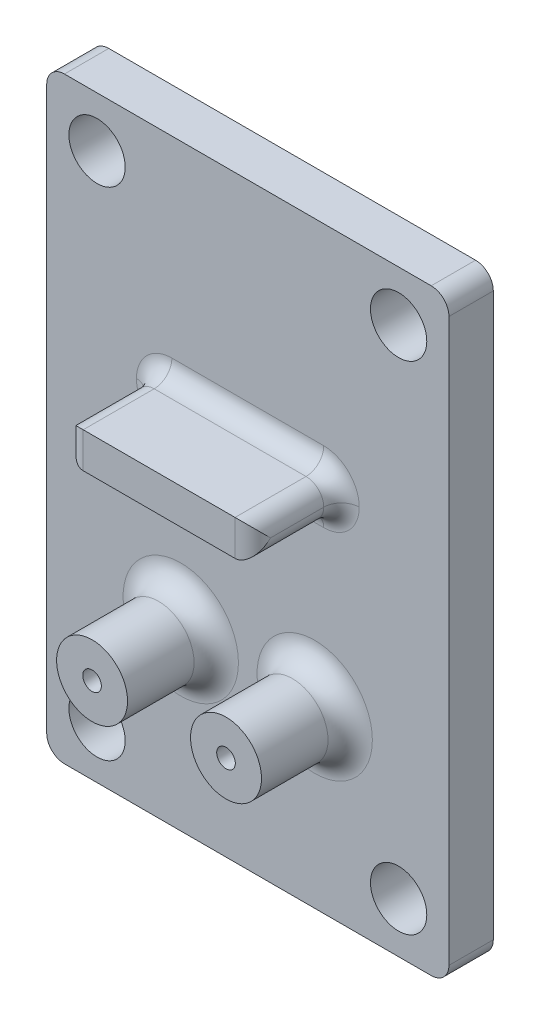
ISO-10303-21;
HEADER;
FILE_DESCRIPTION(('STEP AP214'),'2;1');
FILE_NAME('part.step','',(''),(''),'','','');
FILE_SCHEMA(('AUTOMOTIVE_DESIGN { 1 0 10303 214 1 1 1 1 }'));
ENDSEC;
DATA;
#1=APPLICATION_CONTEXT('core data for automotive mechanical design processes');
#2=APPLICATION_PROTOCOL_DEFINITION('international standard','automotive_design',2000,#1);
#3=PRODUCT_CONTEXT('',#1,'mechanical');
#4=PRODUCT('Part','Part','',(#3));
#5=PRODUCT_RELATED_PRODUCT_CATEGORY('part','',(#4));
#6=PRODUCT_DEFINITION_FORMATION('','',#4);
#7=PRODUCT_DEFINITION_CONTEXT('part definition',#1,'design');
#8=PRODUCT_DEFINITION('design','',#6,#7);
#9=PRODUCT_DEFINITION_SHAPE('','',#8);
#10=(LENGTH_UNIT() NAMED_UNIT(*) SI_UNIT(.MILLI.,.METRE.));
#11=(NAMED_UNIT(*) PLANE_ANGLE_UNIT() SI_UNIT($,.RADIAN.));
#12=(NAMED_UNIT(*) SI_UNIT($,.STERADIAN.) SOLID_ANGLE_UNIT());
#13=UNCERTAINTY_MEASURE_WITH_UNIT(LENGTH_MEASURE(1.E-05),#10,'distance_accuracy_value','');
#14=(GEOMETRIC_REPRESENTATION_CONTEXT(3) GLOBAL_UNCERTAINTY_ASSIGNED_CONTEXT((#13)) GLOBAL_UNIT_ASSIGNED_CONTEXT((#10,
#11,#12)) REPRESENTATION_CONTEXT('',''));
#15=CARTESIAN_POINT('',(0.,0.,0.));
#16=DIRECTION('',(0.,0.,1.));
#17=DIRECTION('',(1.,0.,0.));
#18=AXIS2_PLACEMENT_3D('',#15,#16,#17);
#19=CARTESIAN_POINT('',(0.,0.,5.));
#20=DIRECTION('',(0.,0.,1.));
#21=DIRECTION('',(1.,0.,0.));
#22=AXIS2_PLACEMENT_3D('',#19,#20,#21);
#23=PLANE('',#22);
#24=CARTESIAN_POINT('',(7.54,-14.,5.));
#25=DIRECTION('',(0.,0.,1.));
#26=DIRECTION('',(1.,0.,0.));
#27=AXIS2_PLACEMENT_3D('',#24,#25,#26);
#28=CIRCLE('',#27,6.5);
#29=CARTESIAN_POINT('',(14.04,-14.,5.));
#30=VERTEX_POINT('',#29);
#31=EDGE_CURVE('E52',#30,#30,#28,.F.);
#32=ORIENTED_EDGE('',*,*,#31,.T.);
#33=EDGE_LOOP('',(#32));
#34=FACE_BOUND('',#33,.T.);
#35=CARTESIAN_POINT('',(-7.56,-14.,5.));
#36=DIRECTION('',(0.,0.,1.));
#37=DIRECTION('',(1.,0.,0.));
#38=AXIS2_PLACEMENT_3D('',#35,#36,#37);
#39=CIRCLE('',#38,6.5);
#40=CARTESIAN_POINT('',(-1.06,-14.,5.));
#41=VERTEX_POINT('',#40);
#42=EDGE_CURVE('E202',#41,#41,#39,.F.);
#43=ORIENTED_EDGE('',*,*,#42,.T.);
#44=EDGE_LOOP('',(#43));
#45=FACE_BOUND('',#44,.T.);
#46=DIRECTION('',(1.,0.,0.));
#47=VECTOR('',#46,1.);
#48=CARTESIAN_POINT('',(0.,33.675,5.));
#49=LINE('',#48,#47);
#50=CARTESIAN_POINT('',(-20.675,33.675,5.));
#51=VERTEX_POINT('',#50);
#52=CARTESIAN_POINT('',(20.675,33.675,5.));
#53=VERTEX_POINT('',#52);
#54=EDGE_CURVE('E288',#51,#53,#49,.T.);
#55=ORIENTED_EDGE('',*,*,#54,.F.);
#56=CARTESIAN_POINT('',(-20.675,31.675,5.));
#57=DIRECTION('',(0.,0.,1.));
#58=DIRECTION('',(1.,0.,0.));
#59=AXIS2_PLACEMENT_3D('',#56,#57,#58);
#60=CIRCLE('',#59,2.);
#61=CARTESIAN_POINT('',(-22.675,31.675,5.));
#62=VERTEX_POINT('',#61);
#63=EDGE_CURVE('E344',#51,#62,#60,.T.);
#64=ORIENTED_EDGE('',*,*,#63,.T.);
#65=DIRECTION('',(0.,-1.,0.));
#66=VECTOR('',#65,1.);
#67=CARTESIAN_POINT('',(-22.675,0.,5.));
#68=LINE('',#67,#66);
#69=CARTESIAN_POINT('',(-22.675,-31.675,5.));
#70=VERTEX_POINT('',#69);
#71=EDGE_CURVE('E291',#62,#70,#68,.T.);
#72=ORIENTED_EDGE('',*,*,#71,.T.);
#73=CARTESIAN_POINT('',(-20.675,-31.675,5.));
#74=DIRECTION('',(0.,0.,1.));
#75=DIRECTION('',(1.,0.,0.));
#76=AXIS2_PLACEMENT_3D('',#73,#74,#75);
#77=CIRCLE('',#76,2.);
#78=CARTESIAN_POINT('',(-20.675,-33.675,5.));
#79=VERTEX_POINT('',#78);
#80=EDGE_CURVE('E338',#70,#79,#77,.T.);
#81=ORIENTED_EDGE('',*,*,#80,.T.);
#82=DIRECTION('',(1.,0.,0.));
#83=VECTOR('',#82,1.);
#84=CARTESIAN_POINT('',(0.,-33.675,5.));
#85=LINE('',#84,#83);
#86=CARTESIAN_POINT('',(20.675,-33.675,5.));
#87=VERTEX_POINT('',#86);
#88=EDGE_CURVE('E294',#79,#87,#85,.T.);
#89=ORIENTED_EDGE('',*,*,#88,.T.);
#90=CARTESIAN_POINT('',(20.675,-31.675,5.));
#91=DIRECTION('',(0.,0.,1.));
#92=DIRECTION('',(1.,0.,0.));
#93=AXIS2_PLACEMENT_3D('',#90,#91,#92);
#94=CIRCLE('',#93,2.);
#95=CARTESIAN_POINT('',(22.675,-31.675,5.));
#96=VERTEX_POINT('',#95);
#97=EDGE_CURVE('E340',#87,#96,#94,.T.);
#98=ORIENTED_EDGE('',*,*,#97,.T.);
#99=DIRECTION('',(0.,-1.,0.));
#100=VECTOR('',#99,1.);
#101=CARTESIAN_POINT('',(22.675,0.,5.));
#102=LINE('',#101,#100);
#103=CARTESIAN_POINT('',(22.675,31.675,5.));
#104=VERTEX_POINT('',#103);
#105=EDGE_CURVE('E285',#104,#96,#102,.T.);
#106=ORIENTED_EDGE('',*,*,#105,.F.);
#107=CARTESIAN_POINT('',(20.675,31.675,5.));
#108=DIRECTION('',(0.,0.,1.));
#109=DIRECTION('',(1.,0.,0.));
#110=AXIS2_PLACEMENT_3D('',#107,#108,#109);
#111=CIRCLE('',#110,2.);
#112=EDGE_CURVE('E342',#104,#53,#111,.T.);
#113=ORIENTED_EDGE('',*,*,#112,.T.);
#114=EDGE_LOOP('',(#55,#64,#72,#81,#89,#98,#106,#113));
#115=FACE_BOUND('',#114,.T.);
#116=CARTESIAN_POINT('',(-17.,28.,5.));
#117=DIRECTION('',(0.,0.,1.));
#118=DIRECTION('',(1.,0.,0.));
#119=AXIS2_PLACEMENT_3D('',#116,#117,#118);
#120=CIRCLE('',#119,3.175);
#121=CARTESIAN_POINT('',(-13.825,28.,5.));
#122=VERTEX_POINT('',#121);
#123=EDGE_CURVE('E282',#122,#122,#120,.T.);
#124=ORIENTED_EDGE('',*,*,#123,.F.);
#125=EDGE_LOOP('',(#124));
#126=FACE_BOUND('',#125,.T.);
#127=CARTESIAN_POINT('',(17.,28.,5.));
#128=DIRECTION('',(0.,0.,1.));
#129=DIRECTION('',(1.,0.,0.));
#130=AXIS2_PLACEMENT_3D('',#127,#128,#129);
#131=CIRCLE('',#130,3.175);
#132=CARTESIAN_POINT('',(20.175,28.,5.));
#133=VERTEX_POINT('',#132);
#134=EDGE_CURVE('E279',#133,#133,#131,.T.);
#135=ORIENTED_EDGE('',*,*,#134,.F.);
#136=EDGE_LOOP('',(#135));
#137=FACE_BOUND('',#136,.T.);
#138=CARTESIAN_POINT('',(17.,-28.,5.));
#139=DIRECTION('',(0.,0.,1.));
#140=DIRECTION('',(1.,0.,0.));
#141=AXIS2_PLACEMENT_3D('',#138,#139,#140);
#142=CIRCLE('',#141,3.175);
#143=CARTESIAN_POINT('',(20.175,-28.,5.));
#144=VERTEX_POINT('',#143);
#145=EDGE_CURVE('E275',#144,#144,#142,.T.);
#146=ORIENTED_EDGE('',*,*,#145,.F.);
#147=EDGE_LOOP('',(#146));
#148=FACE_BOUND('',#147,.T.);
#149=CARTESIAN_POINT('',(-17.,-28.,5.));
#150=DIRECTION('',(0.,0.,1.));
#151=DIRECTION('',(1.,0.,0.));
#152=AXIS2_PLACEMENT_3D('',#149,#150,#151);
#153=CIRCLE('',#152,3.175);
#154=CARTESIAN_POINT('',(-13.825,-28.,5.));
#155=VERTEX_POINT('',#154);
#156=EDGE_CURVE('E272',#155,#155,#153,.T.);
#157=ORIENTED_EDGE('',*,*,#156,.F.);
#158=EDGE_LOOP('',(#157));
#159=FACE_BOUND('',#158,.T.);
#160=CARTESIAN_POINT('',(8.56,8.00000000000001,5.));
#161=DIRECTION('',(0.,0.,1.));
#162=DIRECTION('',(1.,0.,0.));
#163=AXIS2_PLACEMENT_3D('',#160,#161,#162);
#164=CIRCLE('',#163,4.);
#165=CARTESIAN_POINT('',(12.56,8.00000000000001,5.));
#166=VERTEX_POINT('',#165);
#167=CARTESIAN_POINT('',(8.56,12.,5.));
#168=VERTEX_POINT('',#167);
#169=EDGE_CURVE('E370',#166,#168,#164,.T.);
#170=ORIENTED_EDGE('',*,*,#169,.F.);
#171=CARTESIAN_POINT('',(8.56,8.00000000000001,5.));
#172=DIRECTION('',(0.,0.,1.));
#173=DIRECTION('',(1.,0.,0.));
#174=AXIS2_PLACEMENT_3D('',#171,#172,#173);
#175=CIRCLE('',#174,4.);
#176=CARTESIAN_POINT('',(8.56,4.00000000000001,5.));
#177=VERTEX_POINT('',#176);
#178=EDGE_CURVE('E367',#177,#166,#175,.T.);
#179=ORIENTED_EDGE('',*,*,#178,.F.);
#180=DIRECTION('',(1.,0.,0.));
#181=VECTOR('',#180,1.);
#182=CARTESIAN_POINT('',(0.,4.00000000000001,5.));
#183=LINE('',#182,#181);
#184=CARTESIAN_POINT('',(-8.56,4.00000000000001,5.));
#185=VERTEX_POINT('',#184);
#186=EDGE_CURVE('E362',#177,#185,#183,.F.);
#187=ORIENTED_EDGE('',*,*,#186,.T.);
#188=CARTESIAN_POINT('',(-8.56,8.00000000000001,5.));
#189=DIRECTION('',(0.,0.,1.));
#190=DIRECTION('',(1.,0.,0.));
#191=AXIS2_PLACEMENT_3D('',#188,#189,#190);
#192=CIRCLE('',#191,4.);
#193=CARTESIAN_POINT('',(-12.56,8.00000000000001,5.));
#194=VERTEX_POINT('',#193);
#195=EDGE_CURVE('E359',#194,#185,#192,.T.);
#196=ORIENTED_EDGE('',*,*,#195,.F.);
#197=CARTESIAN_POINT('',(-8.56,8.00000000000001,5.));
#198=DIRECTION('',(0.,0.,1.));
#199=DIRECTION('',(1.,0.,0.));
#200=AXIS2_PLACEMENT_3D('',#197,#198,#199);
#201=CIRCLE('',#200,4.);
#202=CARTESIAN_POINT('',(-8.56,12.,5.));
#203=VERTEX_POINT('',#202);
#204=EDGE_CURVE('E356',#203,#194,#201,.T.);
#205=ORIENTED_EDGE('',*,*,#204,.F.);
#206=DIRECTION('',(1.,0.,0.));
#207=VECTOR('',#206,1.);
#208=CARTESIAN_POINT('',(10.56,12.,5.));
#209=LINE('',#208,#207);
#210=EDGE_CURVE('E364',#203,#168,#209,.T.);
#211=ORIENTED_EDGE('',*,*,#210,.T.);
#212=EDGE_LOOP('',(#170,#179,#187,#196,#205,#211));
#213=FACE_BOUND('',#212,.T.);
#214=ADVANCED_FACE('F43',(#34,#45,#115,#126,#137,#148,#159,#213),#23,.T.);
#215=CARTESIAN_POINT('',(22.675,0.,5.));
#216=DIRECTION('',(1.,0.,0.));
#217=DIRECTION('',(0.,0.,-1.));
#218=AXIS2_PLACEMENT_3D('',#215,#216,#217);
#219=PLANE('',#218);
#220=DIRECTION('',(0.,-1.,0.));
#221=VECTOR('',#220,1.);
#222=CARTESIAN_POINT('',(22.675,0.,0.));
#223=LINE('',#222,#221);
#224=CARTESIAN_POINT('',(22.675,31.675,0.));
#225=VERTEX_POINT('',#224);
#226=CARTESIAN_POINT('',(22.675,-31.675,0.));
#227=VERTEX_POINT('',#226);
#228=EDGE_CURVE('E306',#225,#227,#223,.T.);
#229=ORIENTED_EDGE('',*,*,#228,.F.);
#230=DIRECTION('',(0.,0.,-1.));
#231=VECTOR('',#230,1.);
#232=CARTESIAN_POINT('',(22.675,31.675,5.));
#233=LINE('',#232,#231);
#234=EDGE_CURVE('E349',#225,#104,#233,.F.);
#235=ORIENTED_EDGE('',*,*,#234,.T.);
#236=ORIENTED_EDGE('',*,*,#105,.T.);
#237=DIRECTION('',(0.,0.,-1.));
#238=VECTOR('',#237,1.);
#239=CARTESIAN_POINT('',(22.675,-31.675,0.));
#240=LINE('',#239,#238);
#241=EDGE_CURVE('E346',#96,#227,#240,.T.);
#242=ORIENTED_EDGE('',*,*,#241,.T.);
#243=EDGE_LOOP('',(#229,#235,#236,#242));
#244=FACE_BOUND('',#243,.T.);
#245=ADVANCED_FACE('F435',(#244),#219,.T.);
#246=CARTESIAN_POINT('',(0.,33.675,5.));
#247=DIRECTION('',(0.,1.,0.));
#248=DIRECTION('',(0.,0.,1.));
#249=AXIS2_PLACEMENT_3D('',#246,#247,#248);
#250=PLANE('',#249);
#251=DIRECTION('',(1.,0.,0.));
#252=VECTOR('',#251,1.);
#253=CARTESIAN_POINT('',(0.,33.675,0.));
#254=LINE('',#253,#252);
#255=CARTESIAN_POINT('',(-20.675,33.675,0.));
#256=VERTEX_POINT('',#255);
#257=CARTESIAN_POINT('',(20.675,33.675,0.));
#258=VERTEX_POINT('',#257);
#259=EDGE_CURVE('E309',#256,#258,#254,.T.);
#260=ORIENTED_EDGE('',*,*,#259,.F.);
#261=DIRECTION('',(0.,0.,-1.));
#262=VECTOR('',#261,1.);
#263=CARTESIAN_POINT('',(-20.675,33.675,5.));
#264=LINE('',#263,#262);
#265=EDGE_CURVE('E336',#256,#51,#264,.F.);
#266=ORIENTED_EDGE('',*,*,#265,.T.);
#267=ORIENTED_EDGE('',*,*,#54,.T.);
#268=DIRECTION('',(0.,0.,-1.));
#269=VECTOR('',#268,1.);
#270=CARTESIAN_POINT('',(20.675,33.675,5.));
#271=LINE('',#270,#269);
#272=EDGE_CURVE('E333',#53,#258,#271,.T.);
#273=ORIENTED_EDGE('',*,*,#272,.T.);
#274=EDGE_LOOP('',(#260,#266,#267,#273));
#275=FACE_BOUND('',#274,.T.);
#276=ADVANCED_FACE('F441',(#275),#250,.T.);
#277=CARTESIAN_POINT('',(-22.675,0.,5.));
#278=DIRECTION('',(1.,0.,0.));
#279=DIRECTION('',(0.,0.,-1.));
#280=AXIS2_PLACEMENT_3D('',#277,#278,#279);
#281=PLANE('',#280);
#282=ORIENTED_EDGE('',*,*,#71,.F.);
#283=DIRECTION('',(0.,0.,-1.));
#284=VECTOR('',#283,1.);
#285=CARTESIAN_POINT('',(-22.675,31.675,0.));
#286=LINE('',#285,#284);
#287=CARTESIAN_POINT('',(-22.675,31.675,0.));
#288=VERTEX_POINT('',#287);
#289=EDGE_CURVE('E324',#62,#288,#286,.T.);
#290=ORIENTED_EDGE('',*,*,#289,.T.);
#291=DIRECTION('',(0.,-1.,0.));
#292=VECTOR('',#291,1.);
#293=CARTESIAN_POINT('',(-22.675,0.,0.));
#294=LINE('',#293,#292);
#295=CARTESIAN_POINT('',(-22.675,-31.675,0.));
#296=VERTEX_POINT('',#295);
#297=EDGE_CURVE('E312',#288,#296,#294,.T.);
#298=ORIENTED_EDGE('',*,*,#297,.T.);
#299=DIRECTION('',(0.,0.,-1.));
#300=VECTOR('',#299,1.);
#301=CARTESIAN_POINT('',(-22.675,-31.675,5.));
#302=LINE('',#301,#300);
#303=EDGE_CURVE('E322',#296,#70,#302,.F.);
#304=ORIENTED_EDGE('',*,*,#303,.T.);
#305=EDGE_LOOP('',(#282,#290,#298,#304));
#306=FACE_BOUND('',#305,.T.);
#307=ADVANCED_FACE('F476',(#306),#281,.F.);
#308=CARTESIAN_POINT('',(-17.,28.,5.));
#309=DIRECTION('',(0.,0.,-1.));
#310=DIRECTION('',(-1.,0.,0.));
#311=AXIS2_PLACEMENT_3D('',#308,#309,#310);
#312=CYLINDRICAL_SURFACE('',#311,3.175);
#313=ORIENTED_EDGE('',*,*,#123,.T.);
#314=EDGE_LOOP('',(#313));
#315=FACE_BOUND('',#314,.T.);
#316=CARTESIAN_POINT('',(-17.,28.,0.));
#317=DIRECTION('',(0.,0.,1.));
#318=DIRECTION('',(1.,0.,0.));
#319=AXIS2_PLACEMENT_3D('',#316,#317,#318);
#320=CIRCLE('',#319,3.175);
#321=CARTESIAN_POINT('',(-13.825,28.,0.));
#322=VERTEX_POINT('',#321);
#323=EDGE_CURVE('E303',#322,#322,#320,.T.);
#324=ORIENTED_EDGE('',*,*,#323,.F.);
#325=EDGE_LOOP('',(#324));
#326=FACE_BOUND('',#325,.T.);
#327=ADVANCED_FACE('F479',(#315,#326),#312,.F.);
#328=CARTESIAN_POINT('',(17.,28.,5.));
#329=DIRECTION('',(0.,0.,-1.));
#330=DIRECTION('',(-1.,0.,0.));
#331=AXIS2_PLACEMENT_3D('',#328,#329,#330);
#332=CYLINDRICAL_SURFACE('',#331,3.175);
#333=ORIENTED_EDGE('',*,*,#134,.T.);
#334=EDGE_LOOP('',(#333));
#335=FACE_BOUND('',#334,.T.);
#336=CARTESIAN_POINT('',(17.,28.,0.));
#337=DIRECTION('',(0.,0.,1.));
#338=DIRECTION('',(1.,0.,0.));
#339=AXIS2_PLACEMENT_3D('',#336,#337,#338);
#340=CIRCLE('',#339,3.175);
#341=CARTESIAN_POINT('',(20.175,28.,0.));
#342=VERTEX_POINT('',#341);
#343=EDGE_CURVE('E300',#342,#342,#340,.T.);
#344=ORIENTED_EDGE('',*,*,#343,.F.);
#345=EDGE_LOOP('',(#344));
#346=FACE_BOUND('',#345,.T.);
#347=ADVANCED_FACE('F486',(#335,#346),#332,.F.);
#348=CARTESIAN_POINT('',(17.,-28.,5.));
#349=DIRECTION('',(0.,0.,-1.));
#350=DIRECTION('',(-1.,0.,0.));
#351=AXIS2_PLACEMENT_3D('',#348,#349,#350);
#352=CYLINDRICAL_SURFACE('',#351,3.175);
#353=ORIENTED_EDGE('',*,*,#145,.T.);
#354=EDGE_LOOP('',(#353));
#355=FACE_BOUND('',#354,.T.);
#356=CARTESIAN_POINT('',(17.,-28.,0.));
#357=DIRECTION('',(0.,0.,1.));
#358=DIRECTION('',(1.,0.,0.));
#359=AXIS2_PLACEMENT_3D('',#356,#357,#358);
#360=CIRCLE('',#359,3.175);
#361=CARTESIAN_POINT('',(20.175,-28.,0.));
#362=VERTEX_POINT('',#361);
#363=EDGE_CURVE('E265',#362,#362,#360,.T.);
#364=ORIENTED_EDGE('',*,*,#363,.F.);
#365=EDGE_LOOP('',(#364));
#366=FACE_BOUND('',#365,.T.);
#367=ADVANCED_FACE('F490',(#355,#366),#352,.F.);
#368=CARTESIAN_POINT('',(-17.,-28.,5.));
#369=DIRECTION('',(0.,0.,-1.));
#370=DIRECTION('',(-1.,0.,0.));
#371=AXIS2_PLACEMENT_3D('',#368,#369,#370);
#372=CYLINDRICAL_SURFACE('',#371,3.175);
#373=ORIENTED_EDGE('',*,*,#156,.T.);
#374=EDGE_LOOP('',(#373));
#375=FACE_BOUND('',#374,.T.);
#376=CARTESIAN_POINT('',(-17.,-28.,0.));
#377=DIRECTION('',(0.,0.,1.));
#378=DIRECTION('',(1.,0.,0.));
#379=AXIS2_PLACEMENT_3D('',#376,#377,#378);
#380=CIRCLE('',#379,3.175);
#381=CARTESIAN_POINT('',(-13.825,-28.,0.));
#382=VERTEX_POINT('',#381);
#383=EDGE_CURVE('E261',#382,#382,#380,.T.);
#384=ORIENTED_EDGE('',*,*,#383,.F.);
#385=EDGE_LOOP('',(#384));
#386=FACE_BOUND('',#385,.T.);
#387=ADVANCED_FACE('F471',(#375,#386),#372,.F.);
#388=CARTESIAN_POINT('',(0.,-33.675,5.));
#389=DIRECTION('',(0.,1.,0.));
#390=DIRECTION('',(0.,0.,1.));
#391=AXIS2_PLACEMENT_3D('',#388,#389,#390);
#392=PLANE('',#391);
#393=DIRECTION('',(1.,0.,0.));
#394=VECTOR('',#393,1.);
#395=CARTESIAN_POINT('',(0.,-33.675,0.));
#396=LINE('',#395,#394);
#397=CARTESIAN_POINT('',(-20.675,-33.675,0.));
#398=VERTEX_POINT('',#397);
#399=CARTESIAN_POINT('',(20.675,-33.675,0.));
#400=VERTEX_POINT('',#399);
#401=EDGE_CURVE('E276',#398,#400,#396,.T.);
#402=ORIENTED_EDGE('',*,*,#401,.T.);
#403=DIRECTION('',(0.,0.,-1.));
#404=VECTOR('',#403,1.);
#405=CARTESIAN_POINT('',(20.675,-33.675,5.));
#406=LINE('',#405,#404);
#407=EDGE_CURVE('E354',#400,#87,#406,.F.);
#408=ORIENTED_EDGE('',*,*,#407,.T.);
#409=ORIENTED_EDGE('',*,*,#88,.F.);
#410=DIRECTION('',(0.,0.,-1.));
#411=VECTOR('',#410,1.);
#412=CARTESIAN_POINT('',(-20.675,-33.675,5.));
#413=LINE('',#412,#411);
#414=EDGE_CURVE('E351',#79,#398,#413,.T.);
#415=ORIENTED_EDGE('',*,*,#414,.T.);
#416=EDGE_LOOP('',(#402,#408,#409,#415));
#417=FACE_BOUND('',#416,.T.);
#418=ADVANCED_FACE('F464',(#417),#392,.F.);
#419=CARTESIAN_POINT('',(0.,0.,0.));
#420=DIRECTION('',(0.,0.,1.));
#421=DIRECTION('',(1.,0.,0.));
#422=AXIS2_PLACEMENT_3D('',#419,#420,#421);
#423=PLANE('',#422);
#424=ORIENTED_EDGE('',*,*,#383,.T.);
#425=EDGE_LOOP('',(#424));
#426=FACE_BOUND('',#425,.T.);
#427=ORIENTED_EDGE('',*,*,#363,.T.);
#428=EDGE_LOOP('',(#427));
#429=FACE_BOUND('',#428,.T.);
#430=ORIENTED_EDGE('',*,*,#343,.T.);
#431=EDGE_LOOP('',(#430));
#432=FACE_BOUND('',#431,.T.);
#433=ORIENTED_EDGE('',*,*,#323,.T.);
#434=EDGE_LOOP('',(#433));
#435=FACE_BOUND('',#434,.T.);
#436=ORIENTED_EDGE('',*,*,#297,.F.);
#437=CARTESIAN_POINT('',(-20.675,31.675,0.));
#438=DIRECTION('',(0.,0.,1.));
#439=DIRECTION('',(1.,0.,0.));
#440=AXIS2_PLACEMENT_3D('',#437,#438,#439);
#441=CIRCLE('',#440,2.);
#442=EDGE_CURVE('E94',#288,#256,#441,.F.);
#443=ORIENTED_EDGE('',*,*,#442,.T.);
#444=ORIENTED_EDGE('',*,*,#259,.T.);
#445=CARTESIAN_POINT('',(20.675,31.675,0.));
#446=DIRECTION('',(0.,0.,1.));
#447=DIRECTION('',(1.,0.,0.));
#448=AXIS2_PLACEMENT_3D('',#445,#446,#447);
#449=CIRCLE('',#448,2.);
#450=EDGE_CURVE('E330',#258,#225,#449,.F.);
#451=ORIENTED_EDGE('',*,*,#450,.T.);
#452=ORIENTED_EDGE('',*,*,#228,.T.);
#453=CARTESIAN_POINT('',(20.675,-31.675,0.));
#454=DIRECTION('',(0.,0.,1.));
#455=DIRECTION('',(1.,0.,0.));
#456=AXIS2_PLACEMENT_3D('',#453,#454,#455);
#457=CIRCLE('',#456,2.);
#458=EDGE_CURVE('E328',#227,#400,#457,.F.);
#459=ORIENTED_EDGE('',*,*,#458,.T.);
#460=ORIENTED_EDGE('',*,*,#401,.F.);
#461=CARTESIAN_POINT('',(-20.675,-31.675,0.));
#462=DIRECTION('',(0.,0.,1.));
#463=DIRECTION('',(1.,0.,0.));
#464=AXIS2_PLACEMENT_3D('',#461,#462,#463);
#465=CIRCLE('',#464,2.);
#466=EDGE_CURVE('E326',#398,#296,#465,.F.);
#467=ORIENTED_EDGE('',*,*,#466,.T.);
#468=EDGE_LOOP('',(#436,#443,#444,#451,#452,#459,#460,#467));
#469=FACE_BOUND('',#468,.T.);
#470=ADVANCED_FACE('F458',(#426,#429,#432,#435,#469),#423,.F.);
#471=CARTESIAN_POINT('',(7.54,-14.,15.));
#472=DIRECTION('',(0.,0.,-1.));
#473=DIRECTION('',(-1.,0.,0.));
#474=AXIS2_PLACEMENT_3D('',#471,#472,#473);
#475=CYLINDRICAL_SURFACE('',#474,1.05);
#476=CARTESIAN_POINT('',(7.54,-14.,15.));
#477=DIRECTION('',(0.,0.,1.));
#478=DIRECTION('',(1.,0.,0.));
#479=AXIS2_PLACEMENT_3D('',#476,#477,#478);
#480=CIRCLE('',#479,1.05);
#481=CARTESIAN_POINT('',(8.59,-14.,15.));
#482=VERTEX_POINT('',#481);
#483=EDGE_CURVE('E262',#482,#482,#480,.T.);
#484=ORIENTED_EDGE('',*,*,#483,.T.);
#485=EDGE_LOOP('',(#484));
#486=FACE_BOUND('',#485,.T.);
#487=CARTESIAN_POINT('',(7.54,-14.,5.));
#488=DIRECTION('',(0.,0.,1.));
#489=DIRECTION('',(1.,0.,0.));
#490=AXIS2_PLACEMENT_3D('',#487,#488,#489);
#491=CIRCLE('',#490,1.05);
#492=CARTESIAN_POINT('',(8.59,-14.,5.));
#493=VERTEX_POINT('',#492);
#494=EDGE_CURVE('E296',#493,#493,#491,.F.);
#495=ORIENTED_EDGE('',*,*,#494,.T.);
#496=EDGE_LOOP('',(#495));
#497=FACE_BOUND('',#496,.T.);
#498=ADVANCED_FACE('F255',(#486,#497),#475,.F.);
#499=CARTESIAN_POINT('',(7.54,-14.,15.));
#500=DIRECTION('',(0.,0.,-1.));
#501=DIRECTION('',(-1.,0.,0.));
#502=AXIS2_PLACEMENT_3D('',#499,#500,#501);
#503=CYLINDRICAL_SURFACE('',#502,4.);
#504=CARTESIAN_POINT('',(7.54,-14.,7.5));
#505=DIRECTION('',(0.,0.,1.));
#506=DIRECTION('',(1.,0.,0.));
#507=AXIS2_PLACEMENT_3D('',#504,#505,#506);
#508=CIRCLE('',#507,4.);
#509=CARTESIAN_POINT('',(11.54,-14.,7.5));
#510=VERTEX_POINT('',#509);
#511=EDGE_CURVE('E199',#510,#510,#508,.T.);
#512=ORIENTED_EDGE('',*,*,#511,.T.);
#513=EDGE_LOOP('',(#512));
#514=FACE_BOUND('',#513,.T.);
#515=CARTESIAN_POINT('',(7.54,-14.,15.));
#516=DIRECTION('',(0.,0.,1.));
#517=DIRECTION('',(1.,0.,0.));
#518=AXIS2_PLACEMENT_3D('',#515,#516,#517);
#519=CIRCLE('',#518,4.);
#520=CARTESIAN_POINT('',(11.54,-14.,15.));
#521=VERTEX_POINT('',#520);
#522=EDGE_CURVE('E259',#521,#521,#519,.T.);
#523=ORIENTED_EDGE('',*,*,#522,.F.);
#524=EDGE_LOOP('',(#523));
#525=FACE_BOUND('',#524,.T.);
#526=ADVANCED_FACE('F251',(#514,#525),#503,.T.);
#527=CARTESIAN_POINT('',(0.,0.,15.));
#528=DIRECTION('',(0.,0.,1.));
#529=DIRECTION('',(1.,0.,0.));
#530=AXIS2_PLACEMENT_3D('',#527,#528,#529);
#531=PLANE('',#530);
#532=ORIENTED_EDGE('',*,*,#483,.F.);
#533=EDGE_LOOP('',(#532));
#534=FACE_BOUND('',#533,.T.);
#535=ORIENTED_EDGE('',*,*,#522,.T.);
#536=EDGE_LOOP('',(#535));
#537=FACE_BOUND('',#536,.T.);
#538=ADVANCED_FACE('F254',(#534,#537),#531,.T.);
#539=ORIENTED_EDGE('',*,*,#494,.F.);
#540=EDGE_LOOP('',(#539));
#541=FACE_BOUND('',#540,.T.);
#542=ADVANCED_FACE('F431',(#541),#23,.T.);
#543=CARTESIAN_POINT('',(-7.56,-14.,15.));
#544=DIRECTION('',(0.,0.,-1.));
#545=DIRECTION('',(-1.,0.,0.));
#546=AXIS2_PLACEMENT_3D('',#543,#544,#545);
#547=CYLINDRICAL_SURFACE('',#546,1.05);
#548=CARTESIAN_POINT('',(-7.56,-14.,15.));
#549=DIRECTION('',(0.,0.,1.));
#550=DIRECTION('',(1.,0.,0.));
#551=AXIS2_PLACEMENT_3D('',#548,#549,#550);
#552=CIRCLE('',#551,1.05);
#553=CARTESIAN_POINT('',(-6.51,-14.,15.));
#554=VERTEX_POINT('',#553);
#555=EDGE_CURVE('E410',#554,#554,#552,.T.);
#556=ORIENTED_EDGE('',*,*,#555,.T.);
#557=EDGE_LOOP('',(#556));
#558=FACE_BOUND('',#557,.T.);
#559=CARTESIAN_POINT('',(-7.56,-14.,5.));
#560=DIRECTION('',(0.,0.,1.));
#561=DIRECTION('',(1.,0.,0.));
#562=AXIS2_PLACEMENT_3D('',#559,#560,#561);
#563=CIRCLE('',#562,1.05);
#564=CARTESIAN_POINT('',(-6.51,-14.,5.));
#565=VERTEX_POINT('',#564);
#566=EDGE_CURVE('E319',#565,#565,#563,.F.);
#567=ORIENTED_EDGE('',*,*,#566,.T.);
#568=EDGE_LOOP('',(#567));
#569=FACE_BOUND('',#568,.T.);
#570=ADVANCED_FACE('F421',(#558,#569),#547,.F.);
#571=CARTESIAN_POINT('',(-7.56,-14.,15.));
#572=DIRECTION('',(0.,0.,-1.));
#573=DIRECTION('',(-1.,0.,0.));
#574=AXIS2_PLACEMENT_3D('',#571,#572,#573);
#575=CYLINDRICAL_SURFACE('',#574,4.);
#576=CARTESIAN_POINT('',(-7.56,-14.,7.5));
#577=DIRECTION('',(0.,0.,1.));
#578=DIRECTION('',(1.,0.,0.));
#579=AXIS2_PLACEMENT_3D('',#576,#577,#578);
#580=CIRCLE('',#579,4.);
#581=CARTESIAN_POINT('',(-3.56,-14.,7.5));
#582=VERTEX_POINT('',#581);
#583=EDGE_CURVE('E11',#582,#582,#580,.T.);
#584=ORIENTED_EDGE('',*,*,#583,.T.);
#585=EDGE_LOOP('',(#584));
#586=FACE_BOUND('',#585,.T.);
#587=CARTESIAN_POINT('',(-7.56,-14.,15.));
#588=DIRECTION('',(0.,0.,1.));
#589=DIRECTION('',(1.,0.,0.));
#590=AXIS2_PLACEMENT_3D('',#587,#588,#589);
#591=CIRCLE('',#590,4.);
#592=CARTESIAN_POINT('',(-3.56,-14.,15.));
#593=VERTEX_POINT('',#592);
#594=EDGE_CURVE('E268',#593,#593,#591,.T.);
#595=ORIENTED_EDGE('',*,*,#594,.F.);
#596=EDGE_LOOP('',(#595));
#597=FACE_BOUND('',#596,.T.);
#598=ADVANCED_FACE('F419',(#586,#597),#575,.T.);
#599=CARTESIAN_POINT('',(0.,0.,15.));
#600=DIRECTION('',(0.,0.,1.));
#601=DIRECTION('',(1.,0.,0.));
#602=AXIS2_PLACEMENT_3D('',#599,#600,#601);
#603=PLANE('',#602);
#604=ORIENTED_EDGE('',*,*,#555,.F.);
#605=EDGE_LOOP('',(#604));
#606=FACE_BOUND('',#605,.T.);
#607=ORIENTED_EDGE('',*,*,#594,.T.);
#608=EDGE_LOOP('',(#607));
#609=FACE_BOUND('',#608,.T.);
#610=ADVANCED_FACE('F417',(#606,#609),#603,.T.);
#611=ORIENTED_EDGE('',*,*,#566,.F.);
#612=EDGE_LOOP('',(#611));
#613=FACE_BOUND('',#612,.T.);
#614=ADVANCED_FACE('F427',(#613),#23,.T.);
#615=CARTESIAN_POINT('',(0.,6.00000000000001,15.));
#616=DIRECTION('',(0.,1.,0.));
#617=DIRECTION('',(-1.,0.,0.));
#618=AXIS2_PLACEMENT_3D('',#615,#616,#617);
#619=PLANE('',#618);
#620=DIRECTION('',(1.,0.,0.));
#621=VECTOR('',#620,1.);
#622=CARTESIAN_POINT('',(0.,6.00000000000001,7.));
#623=LINE('',#622,#621);
#624=CARTESIAN_POINT('',(-8.56,6.00000000000001,7.));
#625=VERTEX_POINT('',#624);
#626=CARTESIAN_POINT('',(8.56,6.00000000000001,7.));
#627=VERTEX_POINT('',#626);
#628=EDGE_CURVE('E60',#625,#627,#623,.T.);
#629=ORIENTED_EDGE('',*,*,#628,.T.);
#630=DIRECTION('',(0.,0.,-1.));
#631=VECTOR('',#630,1.);
#632=CARTESIAN_POINT('',(8.56,6.00000000000001,15.));
#633=LINE('',#632,#631);
#634=CARTESIAN_POINT('',(8.56,6.00000000000001,15.));
#635=VERTEX_POINT('',#634);
#636=EDGE_CURVE('E174',#627,#635,#633,.F.);
#637=ORIENTED_EDGE('',*,*,#636,.T.);
#638=DIRECTION('',(1.,0.,0.));
#639=VECTOR('',#638,1.);
#640=CARTESIAN_POINT('',(0.,6.00000000000001,15.));
#641=LINE('',#640,#639);
#642=CARTESIAN_POINT('',(-8.56,6.00000000000001,15.));
#643=VERTEX_POINT('',#642);
#644=EDGE_CURVE('E177',#643,#635,#641,.T.);
#645=ORIENTED_EDGE('',*,*,#644,.F.);
#646=DIRECTION('',(0.,0.,-1.));
#647=VECTOR('',#646,1.);
#648=CARTESIAN_POINT('',(-8.56,6.00000000000001,5.));
#649=LINE('',#648,#647);
#650=EDGE_CURVE('E380',#643,#625,#649,.T.);
#651=ORIENTED_EDGE('',*,*,#650,.T.);
#652=EDGE_LOOP('',(#629,#637,#645,#651));
#653=FACE_BOUND('',#652,.T.);
#654=ADVANCED_FACE('F176',(#653),#619,.F.);
#655=CARTESIAN_POINT('',(0.,10.,15.));
#656=DIRECTION('',(0.,1.,0.));
#657=DIRECTION('',(-1.,0.,0.));
#658=AXIS2_PLACEMENT_3D('',#655,#656,#657);
#659=PLANE('',#658);
#660=DIRECTION('',(1.,0.,0.));
#661=VECTOR('',#660,1.);
#662=CARTESIAN_POINT('',(0.,10.,15.));
#663=LINE('',#662,#661);
#664=CARTESIAN_POINT('',(-8.56,10.,15.));
#665=VERTEX_POINT('',#664);
#666=CARTESIAN_POINT('',(8.56,10.,15.));
#667=VERTEX_POINT('',#666);
#668=EDGE_CURVE('E187',#665,#667,#663,.T.);
#669=ORIENTED_EDGE('',*,*,#668,.T.);
#670=DIRECTION('',(0.,0.,-1.));
#671=VECTOR('',#670,1.);
#672=CARTESIAN_POINT('',(8.56,10.,5.));
#673=LINE('',#672,#671);
#674=CARTESIAN_POINT('',(8.56,10.,7.));
#675=VERTEX_POINT('',#674);
#676=EDGE_CURVE('E378',#667,#675,#673,.T.);
#677=ORIENTED_EDGE('',*,*,#676,.T.);
#678=DIRECTION('',(1.,0.,0.));
#679=VECTOR('',#678,1.);
#680=CARTESIAN_POINT('',(-10.56,10.,7.));
#681=LINE('',#680,#679);
#682=CARTESIAN_POINT('',(-8.56,10.,7.));
#683=VERTEX_POINT('',#682);
#684=EDGE_CURVE('E375',#675,#683,#681,.F.);
#685=ORIENTED_EDGE('',*,*,#684,.T.);
#686=DIRECTION('',(0.,0.,-1.));
#687=VECTOR('',#686,1.);
#688=CARTESIAN_POINT('',(-8.56,10.,15.));
#689=LINE('',#688,#687);
#690=EDGE_CURVE('E373',#683,#665,#689,.F.);
#691=ORIENTED_EDGE('',*,*,#690,.T.);
#692=EDGE_LOOP('',(#669,#677,#685,#691));
#693=FACE_BOUND('',#692,.T.);
#694=ADVANCED_FACE('F408',(#693),#659,.T.);
#695=CARTESIAN_POINT('',(0.,0.,15.));
#696=DIRECTION('',(0.,0.,1.));
#697=DIRECTION('',(1.,0.,0.));
#698=AXIS2_PLACEMENT_3D('',#695,#696,#697);
#699=PLANE('',#698);
#700=ORIENTED_EDGE('',*,*,#644,.T.);
#701=DIRECTION('',(0.,1.,0.));
#702=VECTOR('',#701,1.);
#703=CARTESIAN_POINT('',(8.56,10.,15.));
#704=LINE('',#703,#702);
#705=EDGE_CURVE('E184',#635,#667,#704,.T.);
#706=ORIENTED_EDGE('',*,*,#705,.T.);
#707=ORIENTED_EDGE('',*,*,#668,.F.);
#708=DIRECTION('',(0.,1.,0.));
#709=VECTOR('',#708,1.);
#710=CARTESIAN_POINT('',(-8.56,0.,15.));
#711=LINE('',#710,#709);
#712=EDGE_CURVE('E179',#665,#643,#711,.F.);
#713=ORIENTED_EDGE('',*,*,#712,.T.);
#714=EDGE_LOOP('',(#700,#706,#707,#713));
#715=FACE_BOUND('',#714,.T.);
#716=ADVANCED_FACE('F182',(#715),#699,.T.);
#717=CARTESIAN_POINT('',(-20.675,31.675,5.));
#718=DIRECTION('',(0.,0.,1.));
#719=DIRECTION('',(1.,0.,0.));
#720=AXIS2_PLACEMENT_3D('',#717,#718,#719);
#721=CYLINDRICAL_SURFACE('',#720,2.);
#722=ORIENTED_EDGE('',*,*,#63,.F.);
#723=ORIENTED_EDGE('',*,*,#265,.F.);
#724=ORIENTED_EDGE('',*,*,#442,.F.);
#725=ORIENTED_EDGE('',*,*,#289,.F.);
#726=EDGE_LOOP('',(#722,#723,#724,#725));
#727=FACE_BOUND('',#726,.T.);
#728=ADVANCED_FACE('F497',(#727),#721,.T.);
#729=CARTESIAN_POINT('',(20.675,31.675,5.));
#730=DIRECTION('',(0.,0.,-1.));
#731=DIRECTION('',(-1.,0.,0.));
#732=AXIS2_PLACEMENT_3D('',#729,#730,#731);
#733=CYLINDRICAL_SURFACE('',#732,2.);
#734=ORIENTED_EDGE('',*,*,#112,.F.);
#735=ORIENTED_EDGE('',*,*,#234,.F.);
#736=ORIENTED_EDGE('',*,*,#450,.F.);
#737=ORIENTED_EDGE('',*,*,#272,.F.);
#738=EDGE_LOOP('',(#734,#735,#736,#737));
#739=FACE_BOUND('',#738,.T.);
#740=ADVANCED_FACE('F499',(#739),#733,.T.);
#741=CARTESIAN_POINT('',(20.675,-31.675,5.));
#742=DIRECTION('',(0.,0.,1.));
#743=DIRECTION('',(1.,0.,0.));
#744=AXIS2_PLACEMENT_3D('',#741,#742,#743);
#745=CYLINDRICAL_SURFACE('',#744,2.);
#746=ORIENTED_EDGE('',*,*,#97,.F.);
#747=ORIENTED_EDGE('',*,*,#407,.F.);
#748=ORIENTED_EDGE('',*,*,#458,.F.);
#749=ORIENTED_EDGE('',*,*,#241,.F.);
#750=EDGE_LOOP('',(#746,#747,#748,#749));
#751=FACE_BOUND('',#750,.T.);
#752=ADVANCED_FACE('F502',(#751),#745,.T.);
#753=CARTESIAN_POINT('',(-20.675,-31.675,5.));
#754=DIRECTION('',(0.,0.,-1.));
#755=DIRECTION('',(-1.,0.,0.));
#756=AXIS2_PLACEMENT_3D('',#753,#754,#755);
#757=CYLINDRICAL_SURFACE('',#756,2.);
#758=ORIENTED_EDGE('',*,*,#80,.F.);
#759=ORIENTED_EDGE('',*,*,#303,.F.);
#760=ORIENTED_EDGE('',*,*,#466,.F.);
#761=ORIENTED_EDGE('',*,*,#414,.F.);
#762=EDGE_LOOP('',(#758,#759,#760,#761));
#763=FACE_BOUND('',#762,.T.);
#764=ADVANCED_FACE('F506',(#763),#757,.T.);
#765=CARTESIAN_POINT('',(0.,4.00000000000001,7.));
#766=DIRECTION('',(1.,0.,0.));
#767=DIRECTION('',(0.,1.,0.));
#768=AXIS2_PLACEMENT_3D('',#765,#766,#767);
#769=CYLINDRICAL_SURFACE('',#768,2.);
#770=CARTESIAN_POINT('',(8.56,4.00000000000001,7.));
#771=DIRECTION('',(-1.,0.,0.));
#772=DIRECTION('',(0.,0.,1.));
#773=AXIS2_PLACEMENT_3D('',#770,#771,#772);
#774=CIRCLE('',#773,2.);
#775=EDGE_CURVE('E230',#627,#177,#774,.T.);
#776=ORIENTED_EDGE('',*,*,#775,.F.);
#777=ORIENTED_EDGE('',*,*,#628,.F.);
#778=CARTESIAN_POINT('',(-8.56,4.00000000000001,7.));
#779=DIRECTION('',(1.,0.,0.));
#780=DIRECTION('',(0.,0.,-1.));
#781=AXIS2_PLACEMENT_3D('',#778,#779,#780);
#782=CIRCLE('',#781,2.);
#783=EDGE_CURVE('E233',#185,#625,#782,.T.);
#784=ORIENTED_EDGE('',*,*,#783,.F.);
#785=ORIENTED_EDGE('',*,*,#186,.F.);
#786=EDGE_LOOP('',(#776,#777,#784,#785));
#787=FACE_BOUND('',#786,.T.);
#788=ADVANCED_FACE('F385',(#787),#769,.F.);
#789=CARTESIAN_POINT('',(-8.56,0.,13.));
#790=DIRECTION('',(0.,1.,0.));
#791=DIRECTION('',(0.,0.,1.));
#792=AXIS2_PLACEMENT_3D('',#789,#790,#791);
#793=CYLINDRICAL_SURFACE('',#792,2.);
#794=CARTESIAN_POINT('',(-8.56,8.00000000000001,13.));
#795=DIRECTION('',(0.,0.707106781186547,0.707106781186547));
#796=DIRECTION('',(0.,-0.707106781186547,0.707106781186547));
#797=AXIS2_PLACEMENT_3D('',#794,#795,#796);
#798=ELLIPSE('',#797,2.82842712474619,2.);
#799=CARTESIAN_POINT('',(-10.56,8.00000000000001,13.));
#800=VERTEX_POINT('',#799);
#801=EDGE_CURVE('E85',#643,#800,#798,.F.);
#802=ORIENTED_EDGE('',*,*,#801,.F.);
#803=ORIENTED_EDGE('',*,*,#712,.F.);
#804=CARTESIAN_POINT('',(-8.56,8.00000000000001,13.));
#805=DIRECTION('',(0.,0.707106781186547,-0.707106781186547));
#806=DIRECTION('',(0.,0.707106781186547,0.707106781186547));
#807=AXIS2_PLACEMENT_3D('',#804,#805,#806);
#808=ELLIPSE('',#807,2.82842712474619,2.);
#809=EDGE_CURVE('E194',#800,#665,#808,.T.);
#810=ORIENTED_EDGE('',*,*,#809,.F.);
#811=EDGE_LOOP('',(#802,#803,#810));
#812=FACE_BOUND('',#811,.T.);
#813=ADVANCED_FACE('F534',(#812),#793,.T.);
#814=CARTESIAN_POINT('',(-8.56,8.00000000000001,15.));
#815=DIRECTION('',(0.,0.,1.));
#816=DIRECTION('',(1.,0.,0.));
#817=AXIS2_PLACEMENT_3D('',#814,#815,#816);
#818=CYLINDRICAL_SURFACE('',#817,2.);
#819=CARTESIAN_POINT('',(-8.56,8.00000000000001,7.));
#820=DIRECTION('',(0.,0.,1.));
#821=DIRECTION('',(1.,0.,0.));
#822=AXIS2_PLACEMENT_3D('',#819,#820,#821);
#823=CIRCLE('',#822,2.);
#824=CARTESIAN_POINT('',(-10.56,8.00000000000001,7.));
#825=VERTEX_POINT('',#824);
#826=EDGE_CURVE('E236',#625,#825,#823,.F.);
#827=ORIENTED_EDGE('',*,*,#826,.F.);
#828=ORIENTED_EDGE('',*,*,#650,.F.);
#829=ORIENTED_EDGE('',*,*,#801,.T.);
#830=DIRECTION('',(0.,0.,-1.));
#831=VECTOR('',#830,1.);
#832=CARTESIAN_POINT('',(-10.56,8.00000000000001,15.));
#833=LINE('',#832,#831);
#834=EDGE_CURVE('E224',#825,#800,#833,.F.);
#835=ORIENTED_EDGE('',*,*,#834,.F.);
#836=EDGE_LOOP('',(#827,#828,#829,#835));
#837=FACE_BOUND('',#836,.T.);
#838=ADVANCED_FACE('F388',(#837),#818,.T.);
#839=CARTESIAN_POINT('',(-8.56,8.00000000000001,7.));
#840=DIRECTION('',(0.,0.,1.));
#841=DIRECTION('',(1.,0.,0.));
#842=AXIS2_PLACEMENT_3D('',#839,#840,#841);
#843=TOROIDAL_SURFACE('',#842,4.,2.);
#844=ORIENTED_EDGE('',*,*,#783,.T.);
#845=ORIENTED_EDGE('',*,*,#826,.T.);
#846=CARTESIAN_POINT('',(-12.56,8.00000000000001,7.));
#847=DIRECTION('',(0.,1.,0.));
#848=DIRECTION('',(0.,0.,1.));
#849=AXIS2_PLACEMENT_3D('',#846,#847,#848);
#850=CIRCLE('',#849,2.);
#851=EDGE_CURVE('E221',#194,#825,#850,.F.);
#852=ORIENTED_EDGE('',*,*,#851,.F.);
#853=ORIENTED_EDGE('',*,*,#195,.T.);
#854=EDGE_LOOP('',(#844,#845,#852,#853));
#855=FACE_BOUND('',#854,.T.);
#856=ADVANCED_FACE('F392',(#855),#843,.F.);
#857=CARTESIAN_POINT('',(8.56,8.00000000000001,7.));
#858=DIRECTION('',(0.,0.,1.));
#859=DIRECTION('',(1.,0.,0.));
#860=AXIS2_PLACEMENT_3D('',#857,#858,#859);
#861=TOROIDAL_SURFACE('',#860,4.,2.);
#862=CARTESIAN_POINT('',(8.56,8.00000000000001,7.));
#863=DIRECTION('',(0.,0.,1.));
#864=DIRECTION('',(1.,0.,0.));
#865=AXIS2_PLACEMENT_3D('',#862,#863,#864);
#866=CIRCLE('',#865,2.);
#867=CARTESIAN_POINT('',(10.56,8.,7.));
#868=VERTEX_POINT('',#867);
#869=EDGE_CURVE('E193',#627,#868,#866,.T.);
#870=ORIENTED_EDGE('',*,*,#869,.F.);
#871=ORIENTED_EDGE('',*,*,#775,.T.);
#872=ORIENTED_EDGE('',*,*,#178,.T.);
#873=CARTESIAN_POINT('',(12.56,8.00000000000001,7.));
#874=DIRECTION('',(0.,1.,0.));
#875=DIRECTION('',(0.,0.,1.));
#876=AXIS2_PLACEMENT_3D('',#873,#874,#875);
#877=CIRCLE('',#876,2.);
#878=EDGE_CURVE('E218',#868,#166,#877,.F.);
#879=ORIENTED_EDGE('',*,*,#878,.F.);
#880=EDGE_LOOP('',(#870,#871,#872,#879));
#881=FACE_BOUND('',#880,.T.);
#882=ADVANCED_FACE('F396',(#881),#861,.F.);
#883=CARTESIAN_POINT('',(8.56,8.00000000000001,15.));
#884=DIRECTION('',(0.,0.,-1.));
#885=DIRECTION('',(-1.,0.,0.));
#886=AXIS2_PLACEMENT_3D('',#883,#884,#885);
#887=CYLINDRICAL_SURFACE('',#886,2.);
#888=CARTESIAN_POINT('',(8.56,8.00000000000001,13.));
#889=DIRECTION('',(0.,-0.707106781186547,-0.707106781186547));
#890=DIRECTION('',(0.,-0.707106781186547,0.707106781186547));
#891=AXIS2_PLACEMENT_3D('',#888,#889,#890);
#892=ELLIPSE('',#891,2.82842712474619,2.);
#893=CARTESIAN_POINT('',(10.56,8.,13.));
#894=VERTEX_POINT('',#893);
#895=EDGE_CURVE('E77',#635,#894,#892,.F.);
#896=ORIENTED_EDGE('',*,*,#895,.F.);
#897=ORIENTED_EDGE('',*,*,#636,.F.);
#898=ORIENTED_EDGE('',*,*,#869,.T.);
#899=DIRECTION('',(0.,0.,-1.));
#900=VECTOR('',#899,1.);
#901=CARTESIAN_POINT('',(10.56,8.00000000000001,15.));
#902=LINE('',#901,#900);
#903=EDGE_CURVE('E191',#894,#868,#902,.T.);
#904=ORIENTED_EDGE('',*,*,#903,.F.);
#905=EDGE_LOOP('',(#896,#897,#898,#904));
#906=FACE_BOUND('',#905,.T.);
#907=ADVANCED_FACE('F189',(#906),#887,.T.);
#908=CARTESIAN_POINT('',(8.56,0.,13.));
#909=DIRECTION('',(0.,-1.,0.));
#910=DIRECTION('',(1.,0.,0.));
#911=AXIS2_PLACEMENT_3D('',#908,#909,#910);
#912=CYLINDRICAL_SURFACE('',#911,2.);
#913=ORIENTED_EDGE('',*,*,#705,.F.);
#914=ORIENTED_EDGE('',*,*,#895,.T.);
#915=CARTESIAN_POINT('',(8.56,8.00000000000001,13.));
#916=DIRECTION('',(0.,-0.707106781186547,0.707106781186547));
#917=DIRECTION('',(0.,0.707106781186547,0.707106781186547));
#918=AXIS2_PLACEMENT_3D('',#915,#916,#917);
#919=ELLIPSE('',#918,2.82842712474619,2.);
#920=EDGE_CURVE('E197',#667,#894,#919,.F.);
#921=ORIENTED_EDGE('',*,*,#920,.F.);
#922=EDGE_LOOP('',(#913,#914,#921));
#923=FACE_BOUND('',#922,.T.);
#924=ADVANCED_FACE('F196',(#923),#912,.T.);
#925=CARTESIAN_POINT('',(-8.56,8.00000000000001,15.));
#926=DIRECTION('',(0.,0.,-1.));
#927=DIRECTION('',(-1.,0.,0.));
#928=AXIS2_PLACEMENT_3D('',#925,#926,#927);
#929=CYLINDRICAL_SURFACE('',#928,2.);
#930=ORIENTED_EDGE('',*,*,#809,.T.);
#931=ORIENTED_EDGE('',*,*,#690,.F.);
#932=CARTESIAN_POINT('',(-8.56,8.00000000000001,7.));
#933=DIRECTION('',(0.,0.,1.));
#934=DIRECTION('',(1.,0.,0.));
#935=AXIS2_PLACEMENT_3D('',#932,#933,#934);
#936=CIRCLE('',#935,2.);
#937=EDGE_CURVE('E213',#825,#683,#936,.F.);
#938=ORIENTED_EDGE('',*,*,#937,.F.);
#939=ORIENTED_EDGE('',*,*,#834,.T.);
#940=EDGE_LOOP('',(#930,#931,#938,#939));
#941=FACE_BOUND('',#940,.T.);
#942=ADVANCED_FACE('F520',(#941),#929,.T.);
#943=CARTESIAN_POINT('',(8.56,8.00000000000001,15.));
#944=DIRECTION('',(0.,0.,1.));
#945=DIRECTION('',(1.,0.,0.));
#946=AXIS2_PLACEMENT_3D('',#943,#944,#945);
#947=CYLINDRICAL_SURFACE('',#946,2.);
#948=ORIENTED_EDGE('',*,*,#920,.T.);
#949=ORIENTED_EDGE('',*,*,#903,.T.);
#950=CARTESIAN_POINT('',(8.56,8.00000000000001,7.));
#951=DIRECTION('',(0.,0.,1.));
#952=DIRECTION('',(1.,0.,0.));
#953=AXIS2_PLACEMENT_3D('',#950,#951,#952);
#954=CIRCLE('',#953,2.);
#955=EDGE_CURVE('E210',#675,#868,#954,.F.);
#956=ORIENTED_EDGE('',*,*,#955,.F.);
#957=ORIENTED_EDGE('',*,*,#676,.F.);
#958=EDGE_LOOP('',(#948,#949,#956,#957));
#959=FACE_BOUND('',#958,.T.);
#960=ADVANCED_FACE('F401',(#959),#947,.T.);
#961=CARTESIAN_POINT('',(-8.56,8.00000000000001,7.));
#962=DIRECTION('',(0.,0.,1.));
#963=DIRECTION('',(1.,0.,0.));
#964=AXIS2_PLACEMENT_3D('',#961,#962,#963);
#965=TOROIDAL_SURFACE('',#964,4.,2.);
#966=ORIENTED_EDGE('',*,*,#851,.T.);
#967=ORIENTED_EDGE('',*,*,#937,.T.);
#968=CARTESIAN_POINT('',(-8.56,12.,7.));
#969=DIRECTION('',(1.,0.,0.));
#970=DIRECTION('',(0.,0.,-1.));
#971=AXIS2_PLACEMENT_3D('',#968,#969,#970);
#972=CIRCLE('',#971,2.);
#973=EDGE_CURVE('E208',#203,#683,#972,.F.);
#974=ORIENTED_EDGE('',*,*,#973,.F.);
#975=ORIENTED_EDGE('',*,*,#204,.T.);
#976=EDGE_LOOP('',(#966,#967,#974,#975));
#977=FACE_BOUND('',#976,.T.);
#978=ADVANCED_FACE('F514',(#977),#965,.F.);
#979=CARTESIAN_POINT('',(8.56,8.00000000000001,7.));
#980=DIRECTION('',(0.,0.,1.));
#981=DIRECTION('',(1.,0.,0.));
#982=AXIS2_PLACEMENT_3D('',#979,#980,#981);
#983=TOROIDAL_SURFACE('',#982,4.,2.);
#984=ORIENTED_EDGE('',*,*,#878,.T.);
#985=ORIENTED_EDGE('',*,*,#169,.T.);
#986=CARTESIAN_POINT('',(8.56,12.,7.));
#987=DIRECTION('',(-1.,0.,0.));
#988=DIRECTION('',(0.,0.,1.));
#989=AXIS2_PLACEMENT_3D('',#986,#987,#988);
#990=CIRCLE('',#989,2.);
#991=EDGE_CURVE('E206',#675,#168,#990,.F.);
#992=ORIENTED_EDGE('',*,*,#991,.F.);
#993=ORIENTED_EDGE('',*,*,#955,.T.);
#994=EDGE_LOOP('',(#984,#985,#992,#993));
#995=FACE_BOUND('',#994,.T.);
#996=ADVANCED_FACE('F404',(#995),#983,.F.);
#997=CARTESIAN_POINT('',(0.,12.,7.));
#998=DIRECTION('',(-1.,0.,0.));
#999=DIRECTION('',(0.,-1.,0.));
#1000=AXIS2_PLACEMENT_3D('',#997,#998,#999);
#1001=CYLINDRICAL_SURFACE('',#1000,2.);
#1002=ORIENTED_EDGE('',*,*,#973,.T.);
#1003=ORIENTED_EDGE('',*,*,#684,.F.);
#1004=ORIENTED_EDGE('',*,*,#991,.T.);
#1005=ORIENTED_EDGE('',*,*,#210,.F.);
#1006=EDGE_LOOP('',(#1002,#1003,#1004,#1005));
#1007=FACE_BOUND('',#1006,.T.);
#1008=ADVANCED_FACE('F248',(#1007),#1001,.F.);
#1009=CARTESIAN_POINT('',(7.54,-14.,7.5));
#1010=DIRECTION('',(0.,0.,1.));
#1011=DIRECTION('',(1.,0.,0.));
#1012=AXIS2_PLACEMENT_3D('',#1009,#1010,#1011);
#1013=TOROIDAL_SURFACE('',#1012,6.5,2.5);
#1014=ORIENTED_EDGE('',*,*,#31,.F.);
#1015=EDGE_LOOP('',(#1014));
#1016=FACE_BOUND('',#1015,.T.);
#1017=ORIENTED_EDGE('',*,*,#511,.F.);
#1018=EDGE_LOOP('',(#1017));
#1019=FACE_BOUND('',#1018,.T.);
#1020=ADVANCED_FACE('F245',(#1016,#1019),#1013,.F.);
#1021=CARTESIAN_POINT('',(-7.56,-14.,7.5));
#1022=DIRECTION('',(0.,0.,1.));
#1023=DIRECTION('',(1.,0.,0.));
#1024=AXIS2_PLACEMENT_3D('',#1021,#1022,#1023);
#1025=TOROIDAL_SURFACE('',#1024,6.5,2.5);
#1026=ORIENTED_EDGE('',*,*,#42,.F.);
#1027=EDGE_LOOP('',(#1026));
#1028=FACE_BOUND('',#1027,.T.);
#1029=ORIENTED_EDGE('',*,*,#583,.F.);
#1030=EDGE_LOOP('',(#1029));
#1031=FACE_BOUND('',#1030,.T.);
#1032=ADVANCED_FACE('F45',(#1028,#1031),#1025,.F.);
#1033=CLOSED_SHELL('',(#214,#245,#276,#307,#327,#347,#367,#387,#418,#470,#498,#526,#538,#542,
#570,#598,#610,#614,#654,#694,#716,#728,#740,#752,#764,#788,#813,#838,#856,#882,#907,#924,#942,
#960,#978,#996,#1008,#1020,#1032));
#1034=MANIFOLD_SOLID_BREP('B2',#1033);
#1035=ADVANCED_BREP_SHAPE_REPRESENTATION('',(#18,#1034),#14);
#1036=SHAPE_DEFINITION_REPRESENTATION(#9,#1035);
ENDSEC;
END-ISO-10303-21;
